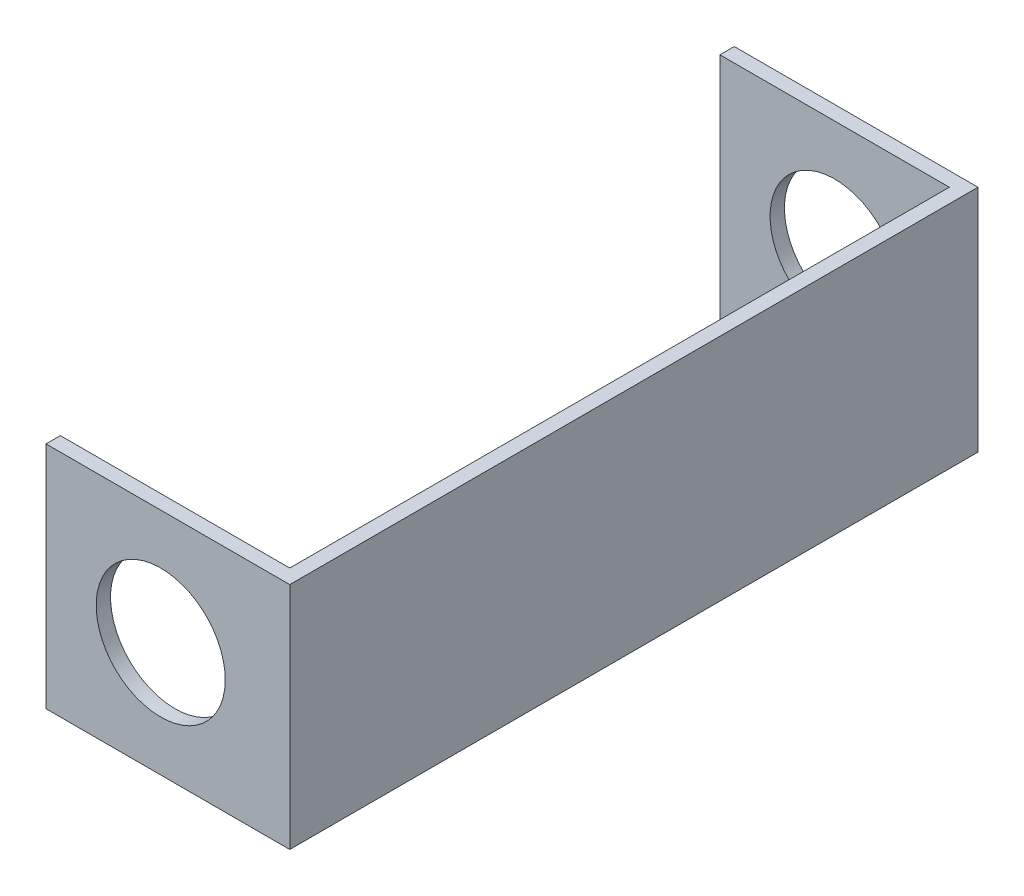
ISO-10303-21;
HEADER;
FILE_DESCRIPTION(('STEP AP214'),'2;1');
FILE_NAME('part.step','',(''),(''),'','','');
FILE_SCHEMA(('AUTOMOTIVE_DESIGN { 1 0 10303 214 1 1 1 1 }'));
ENDSEC;
DATA;
#1=APPLICATION_CONTEXT('core data for automotive mechanical design processes');
#2=APPLICATION_PROTOCOL_DEFINITION('international standard','automotive_design',2000,#1);
#3=PRODUCT_CONTEXT('',#1,'mechanical');
#4=PRODUCT('Part','Part','',(#3));
#5=PRODUCT_RELATED_PRODUCT_CATEGORY('part','',(#4));
#6=PRODUCT_DEFINITION_FORMATION('','',#4);
#7=PRODUCT_DEFINITION_CONTEXT('part definition',#1,'design');
#8=PRODUCT_DEFINITION('design','',#6,#7);
#9=PRODUCT_DEFINITION_SHAPE('','',#8);
#10=(LENGTH_UNIT() NAMED_UNIT(*) SI_UNIT(.MILLI.,.METRE.));
#11=(NAMED_UNIT(*) PLANE_ANGLE_UNIT() SI_UNIT($,.RADIAN.));
#12=(NAMED_UNIT(*) SI_UNIT($,.STERADIAN.) SOLID_ANGLE_UNIT());
#13=UNCERTAINTY_MEASURE_WITH_UNIT(LENGTH_MEASURE(1.E-05),#10,'distance_accuracy_value','');
#14=(GEOMETRIC_REPRESENTATION_CONTEXT(3) GLOBAL_UNCERTAINTY_ASSIGNED_CONTEXT((#13)) GLOBAL_UNIT_ASSIGNED_CONTEXT((#10,
#11,#12)) REPRESENTATION_CONTEXT('',''));
#15=CARTESIAN_POINT('',(0.,0.,0.));
#16=DIRECTION('',(0.,0.,1.));
#17=DIRECTION('',(1.,0.,0.));
#18=AXIS2_PLACEMENT_3D('',#15,#16,#17);
#19=CARTESIAN_POINT('',(0.,0.,3.175));
#20=DIRECTION('',(0.,0.,1.));
#21=DIRECTION('',(1.,0.,0.));
#22=AXIS2_PLACEMENT_3D('',#19,#20,#21);
#23=PLANE('',#22);
#24=DIRECTION('',(0.,-1.,0.));
#25=VECTOR('',#24,1.);
#26=CARTESIAN_POINT('',(50.8,0.,3.175));
#27=LINE('',#26,#25);
#28=CARTESIAN_POINT('',(50.8,0.,3.175));
#29=VERTEX_POINT('',#28);
#30=CARTESIAN_POINT('',(50.8,-50.8,3.175));
#31=VERTEX_POINT('',#30);
#32=EDGE_CURVE('E50',#29,#31,#27,.T.);
#33=ORIENTED_EDGE('',*,*,#32,.F.);
#34=DIRECTION('',(-1.,0.,0.));
#35=VECTOR('',#34,1.);
#36=CARTESIAN_POINT('',(0.,0.,3.175));
#37=LINE('',#36,#35);
#38=CARTESIAN_POINT('',(0.,0.,3.175));
#39=VERTEX_POINT('',#38);
#40=EDGE_CURVE('E55',#29,#39,#37,.T.);
#41=ORIENTED_EDGE('',*,*,#40,.T.);
#42=DIRECTION('',(0.,-1.,0.));
#43=VECTOR('',#42,1.);
#44=CARTESIAN_POINT('',(0.,0.,3.175));
#45=LINE('',#44,#43);
#46=CARTESIAN_POINT('',(0.,-50.8,3.175));
#47=VERTEX_POINT('',#46);
#48=EDGE_CURVE('E86',#39,#47,#45,.T.);
#49=ORIENTED_EDGE('',*,*,#48,.T.);
#50=DIRECTION('',(1.,0.,0.));
#51=VECTOR('',#50,1.);
#52=CARTESIAN_POINT('',(0.,-50.8,3.175));
#53=LINE('',#52,#51);
#54=EDGE_CURVE('E142',#47,#31,#53,.T.);
#55=ORIENTED_EDGE('',*,*,#54,.T.);
#56=EDGE_LOOP('',(#33,#41,#49,#55));
#57=FACE_BOUND('',#56,.T.);
#58=CARTESIAN_POINT('',(25.4,-25.4,3.175));
#59=DIRECTION('',(0.,0.,1.));
#60=DIRECTION('',(1.,0.,0.));
#61=AXIS2_PLACEMENT_3D('',#58,#59,#60);
#62=CIRCLE('',#61,14.2875);
#63=CARTESIAN_POINT('',(39.6875,-25.4,3.175));
#64=VERTEX_POINT('',#63);
#65=EDGE_CURVE('E97',#64,#64,#62,.T.);
#66=ORIENTED_EDGE('',*,*,#65,.F.);
#67=EDGE_LOOP('',(#66));
#68=FACE_BOUND('',#67,.T.);
#69=ADVANCED_FACE('F35',(#57,#68),#23,.T.);
#70=CARTESIAN_POINT('',(0.,0.,0.));
#71=DIRECTION('',(0.,0.,1.));
#72=DIRECTION('',(1.,0.,0.));
#73=AXIS2_PLACEMENT_3D('',#70,#71,#72);
#74=PLANE('',#73);
#75=DIRECTION('',(0.,-1.,0.));
#76=VECTOR('',#75,1.);
#77=CARTESIAN_POINT('',(0.,0.,0.));
#78=LINE('',#77,#76);
#79=CARTESIAN_POINT('',(0.,0.,0.));
#80=VERTEX_POINT('',#79);
#81=CARTESIAN_POINT('',(0.,-50.8,0.));
#82=VERTEX_POINT('',#81);
#83=EDGE_CURVE('E92',#80,#82,#78,.T.);
#84=ORIENTED_EDGE('',*,*,#83,.F.);
#85=DIRECTION('',(-1.,0.,0.));
#86=VECTOR('',#85,1.);
#87=CARTESIAN_POINT('',(0.,0.,0.));
#88=LINE('',#87,#86);
#89=CARTESIAN_POINT('',(53.975,0.,0.));
#90=VERTEX_POINT('',#89);
#91=EDGE_CURVE('E75',#90,#80,#88,.T.);
#92=ORIENTED_EDGE('',*,*,#91,.F.);
#93=DIRECTION('',(0.,1.,0.));
#94=VECTOR('',#93,1.);
#95=CARTESIAN_POINT('',(53.975,0.,0.));
#96=LINE('',#95,#94);
#97=CARTESIAN_POINT('',(53.975,-50.8,0.));
#98=VERTEX_POINT('',#97);
#99=EDGE_CURVE('E87',#98,#90,#96,.T.);
#100=ORIENTED_EDGE('',*,*,#99,.F.);
#101=DIRECTION('',(1.,0.,0.));
#102=VECTOR('',#101,1.);
#103=CARTESIAN_POINT('',(0.,-50.8,0.));
#104=LINE('',#103,#102);
#105=EDGE_CURVE('E96',#82,#98,#104,.T.);
#106=ORIENTED_EDGE('',*,*,#105,.F.);
#107=EDGE_LOOP('',(#84,#92,#100,#106));
#108=FACE_BOUND('',#107,.T.);
#109=CARTESIAN_POINT('',(25.4,-25.4,0.));
#110=DIRECTION('',(0.,0.,1.));
#111=DIRECTION('',(1.,0.,0.));
#112=AXIS2_PLACEMENT_3D('',#109,#110,#111);
#113=CIRCLE('',#112,14.2875);
#114=CARTESIAN_POINT('',(39.6875,-25.4,0.));
#115=VERTEX_POINT('',#114);
#116=EDGE_CURVE('E101',#115,#115,#113,.T.);
#117=ORIENTED_EDGE('',*,*,#116,.T.);
#118=EDGE_LOOP('',(#117));
#119=FACE_BOUND('',#118,.T.);
#120=ADVANCED_FACE('F94',(#108,#119),#74,.F.);
#121=CARTESIAN_POINT('',(0.,0.,3.175));
#122=DIRECTION('',(1.,0.,0.));
#123=DIRECTION('',(0.,0.,-1.));
#124=AXIS2_PLACEMENT_3D('',#121,#122,#123);
#125=PLANE('',#124);
#126=ORIENTED_EDGE('',*,*,#83,.T.);
#127=DIRECTION('',(0.,0.,-1.));
#128=VECTOR('',#127,1.);
#129=CARTESIAN_POINT('',(0.,-50.8,3.175));
#130=LINE('',#129,#128);
#131=EDGE_CURVE('E11',#47,#82,#130,.T.);
#132=ORIENTED_EDGE('',*,*,#131,.F.);
#133=ORIENTED_EDGE('',*,*,#48,.F.);
#134=DIRECTION('',(0.,0.,-1.));
#135=VECTOR('',#134,1.);
#136=CARTESIAN_POINT('',(0.,0.,3.175));
#137=LINE('',#136,#135);
#138=EDGE_CURVE('E78',#39,#80,#137,.T.);
#139=ORIENTED_EDGE('',*,*,#138,.T.);
#140=EDGE_LOOP('',(#126,#132,#133,#139));
#141=FACE_BOUND('',#140,.T.);
#142=ADVANCED_FACE('F37',(#141),#125,.F.);
#143=CARTESIAN_POINT('',(0.,-50.8,3.175));
#144=DIRECTION('',(0.,1.,0.));
#145=DIRECTION('',(0.,0.,1.));
#146=AXIS2_PLACEMENT_3D('',#143,#144,#145);
#147=PLANE('',#146);
#148=ORIENTED_EDGE('',*,*,#105,.T.);
#149=DIRECTION('',(0.,0.,-1.));
#150=VECTOR('',#149,1.);
#151=CARTESIAN_POINT('',(53.975,-50.8,3.175));
#152=LINE('',#151,#150);
#153=CARTESIAN_POINT('',(53.975,-50.8,152.4));
#154=VERTEX_POINT('',#153);
#155=EDGE_CURVE('E43',#154,#98,#152,.T.);
#156=ORIENTED_EDGE('',*,*,#155,.F.);
#157=DIRECTION('',(1.,0.,0.));
#158=VECTOR('',#157,1.);
#159=CARTESIAN_POINT('',(0.,-50.8,152.4));
#160=LINE('',#159,#158);
#161=CARTESIAN_POINT('',(0.,-50.8,152.4));
#162=VERTEX_POINT('',#161);
#163=EDGE_CURVE('E121',#162,#154,#160,.T.);
#164=ORIENTED_EDGE('',*,*,#163,.F.);
#165=DIRECTION('',(0.,0.,-1.));
#166=VECTOR('',#165,1.);
#167=CARTESIAN_POINT('',(0.,-50.8,152.4));
#168=LINE('',#167,#166);
#169=CARTESIAN_POINT('',(0.,-50.8,149.225));
#170=VERTEX_POINT('',#169);
#171=EDGE_CURVE('E298',#162,#170,#168,.T.);
#172=ORIENTED_EDGE('',*,*,#171,.T.);
#173=DIRECTION('',(1.,0.,0.));
#174=VECTOR('',#173,1.);
#175=CARTESIAN_POINT('',(0.,-50.8,149.225));
#176=LINE('',#175,#174);
#177=CARTESIAN_POINT('',(50.8,-50.8,149.225));
#178=VERTEX_POINT('',#177);
#179=EDGE_CURVE('E157',#170,#178,#176,.T.);
#180=ORIENTED_EDGE('',*,*,#179,.T.);
#181=DIRECTION('',(0.,0.,-1.));
#182=VECTOR('',#181,1.);
#183=CARTESIAN_POINT('',(50.8,-50.8,149.225));
#184=LINE('',#183,#182);
#185=EDGE_CURVE('E149',#178,#31,#184,.T.);
#186=ORIENTED_EDGE('',*,*,#185,.T.);
#187=ORIENTED_EDGE('',*,*,#54,.F.);
#188=ORIENTED_EDGE('',*,*,#131,.T.);
#189=EDGE_LOOP('',(#148,#156,#164,#172,#180,#186,#187,#188));
#190=FACE_BOUND('',#189,.T.);
#191=ADVANCED_FACE('F118',(#190),#147,.F.);
#192=CARTESIAN_POINT('',(53.975,0.,3.175));
#193=DIRECTION('',(-1.,0.,0.));
#194=DIRECTION('',(0.,-1.,0.));
#195=AXIS2_PLACEMENT_3D('',#192,#193,#194);
#196=PLANE('',#195);
#197=ORIENTED_EDGE('',*,*,#99,.T.);
#198=DIRECTION('',(0.,0.,-1.));
#199=VECTOR('',#198,1.);
#200=CARTESIAN_POINT('',(53.975,0.,3.175));
#201=LINE('',#200,#199);
#202=CARTESIAN_POINT('',(53.975,0.,152.4));
#203=VERTEX_POINT('',#202);
#204=EDGE_CURVE('E82',#203,#90,#201,.T.);
#205=ORIENTED_EDGE('',*,*,#204,.F.);
#206=DIRECTION('',(0.,1.,0.));
#207=VECTOR('',#206,1.);
#208=CARTESIAN_POINT('',(53.975,0.,152.4));
#209=LINE('',#208,#207);
#210=EDGE_CURVE('E114',#154,#203,#209,.T.);
#211=ORIENTED_EDGE('',*,*,#210,.F.);
#212=ORIENTED_EDGE('',*,*,#155,.T.);
#213=EDGE_LOOP('',(#197,#205,#211,#212));
#214=FACE_BOUND('',#213,.T.);
#215=ADVANCED_FACE('F111',(#214),#196,.F.);
#216=CARTESIAN_POINT('',(0.,0.,3.175));
#217=DIRECTION('',(0.,-1.,0.));
#218=DIRECTION('',(1.,0.,0.));
#219=AXIS2_PLACEMENT_3D('',#216,#217,#218);
#220=PLANE('',#219);
#221=ORIENTED_EDGE('',*,*,#91,.T.);
#222=ORIENTED_EDGE('',*,*,#138,.F.);
#223=ORIENTED_EDGE('',*,*,#40,.F.);
#224=DIRECTION('',(0.,0.,-1.));
#225=VECTOR('',#224,1.);
#226=CARTESIAN_POINT('',(50.8,0.,149.225));
#227=LINE('',#226,#225);
#228=CARTESIAN_POINT('',(50.8,0.,149.225));
#229=VERTEX_POINT('',#228);
#230=EDGE_CURVE('E151',#229,#29,#227,.T.);
#231=ORIENTED_EDGE('',*,*,#230,.F.);
#232=DIRECTION('',(-1.,0.,0.));
#233=VECTOR('',#232,1.);
#234=CARTESIAN_POINT('',(0.,0.,149.225));
#235=LINE('',#234,#233);
#236=CARTESIAN_POINT('',(0.,0.,149.225));
#237=VERTEX_POINT('',#236);
#238=EDGE_CURVE('E307',#229,#237,#235,.T.);
#239=ORIENTED_EDGE('',*,*,#238,.T.);
#240=DIRECTION('',(0.,0.,-1.));
#241=VECTOR('',#240,1.);
#242=CARTESIAN_POINT('',(0.,0.,152.4));
#243=LINE('',#242,#241);
#244=CARTESIAN_POINT('',(0.,0.,152.4));
#245=VERTEX_POINT('',#244);
#246=EDGE_CURVE('E153',#245,#237,#243,.T.);
#247=ORIENTED_EDGE('',*,*,#246,.F.);
#248=DIRECTION('',(-1.,0.,0.));
#249=VECTOR('',#248,1.);
#250=CARTESIAN_POINT('',(0.,0.,152.4));
#251=LINE('',#250,#249);
#252=EDGE_CURVE('E302',#203,#245,#251,.T.);
#253=ORIENTED_EDGE('',*,*,#252,.F.);
#254=ORIENTED_EDGE('',*,*,#204,.T.);
#255=EDGE_LOOP('',(#221,#222,#223,#231,#239,#247,#253,#254));
#256=FACE_BOUND('',#255,.T.);
#257=ADVANCED_FACE('F77',(#256),#220,.F.);
#258=CARTESIAN_POINT('',(25.4,-25.4,3.175));
#259=DIRECTION('',(0.,0.,-1.));
#260=DIRECTION('',(-1.,0.,0.));
#261=AXIS2_PLACEMENT_3D('',#258,#259,#260);
#262=CYLINDRICAL_SURFACE('',#261,14.2875);
#263=ORIENTED_EDGE('',*,*,#65,.T.);
#264=EDGE_LOOP('',(#263));
#265=FACE_BOUND('',#264,.T.);
#266=ORIENTED_EDGE('',*,*,#116,.F.);
#267=EDGE_LOOP('',(#266));
#268=FACE_BOUND('',#267,.T.);
#269=ADVANCED_FACE('F166',(#265,#268),#262,.F.);
#270=CARTESIAN_POINT('',(50.8,0.,149.225));
#271=DIRECTION('',(1.,0.,0.));
#272=DIRECTION('',(0.,1.,0.));
#273=AXIS2_PLACEMENT_3D('',#270,#271,#272);
#274=PLANE('',#273);
#275=ORIENTED_EDGE('',*,*,#32,.T.);
#276=ORIENTED_EDGE('',*,*,#185,.F.);
#277=DIRECTION('',(0.,-1.,0.));
#278=VECTOR('',#277,1.);
#279=CARTESIAN_POINT('',(50.8,0.,149.225));
#280=LINE('',#279,#278);
#281=EDGE_CURVE('E152',#229,#178,#280,.T.);
#282=ORIENTED_EDGE('',*,*,#281,.F.);
#283=ORIENTED_EDGE('',*,*,#230,.T.);
#284=EDGE_LOOP('',(#275,#276,#282,#283));
#285=FACE_BOUND('',#284,.T.);
#286=ADVANCED_FACE('F147',(#285),#274,.F.);
#287=CARTESIAN_POINT('',(0.,0.,149.225));
#288=DIRECTION('',(0.,0.,1.));
#289=DIRECTION('',(1.,0.,0.));
#290=AXIS2_PLACEMENT_3D('',#287,#288,#289);
#291=PLANE('',#290);
#292=CARTESIAN_POINT('',(25.4,-25.4,149.225));
#293=DIRECTION('',(0.,0.,1.));
#294=DIRECTION('',(1.,0.,0.));
#295=AXIS2_PLACEMENT_3D('',#292,#293,#294);
#296=CIRCLE('',#295,14.2875);
#297=CARTESIAN_POINT('',(39.6875,-25.4,149.225));
#298=VERTEX_POINT('',#297);
#299=EDGE_CURVE('E311',#298,#298,#296,.T.);
#300=ORIENTED_EDGE('',*,*,#299,.T.);
#301=EDGE_LOOP('',(#300));
#302=FACE_BOUND('',#301,.T.);
#303=ORIENTED_EDGE('',*,*,#238,.F.);
#304=ORIENTED_EDGE('',*,*,#281,.T.);
#305=ORIENTED_EDGE('',*,*,#179,.F.);
#306=DIRECTION('',(0.,-1.,0.));
#307=VECTOR('',#306,1.);
#308=CARTESIAN_POINT('',(0.,0.,149.225));
#309=LINE('',#308,#307);
#310=EDGE_CURVE('E309',#237,#170,#309,.T.);
#311=ORIENTED_EDGE('',*,*,#310,.F.);
#312=EDGE_LOOP('',(#303,#304,#305,#311));
#313=FACE_BOUND('',#312,.T.);
#314=ADVANCED_FACE('F174',(#302,#313),#291,.F.);
#315=CARTESIAN_POINT('',(0.,0.,152.4));
#316=DIRECTION('',(1.,0.,0.));
#317=DIRECTION('',(0.,0.,-1.));
#318=AXIS2_PLACEMENT_3D('',#315,#316,#317);
#319=PLANE('',#318);
#320=ORIENTED_EDGE('',*,*,#310,.T.);
#321=ORIENTED_EDGE('',*,*,#171,.F.);
#322=DIRECTION('',(0.,-1.,0.));
#323=VECTOR('',#322,1.);
#324=CARTESIAN_POINT('',(0.,0.,152.4));
#325=LINE('',#324,#323);
#326=EDGE_CURVE('E299',#245,#162,#325,.T.);
#327=ORIENTED_EDGE('',*,*,#326,.F.);
#328=ORIENTED_EDGE('',*,*,#246,.T.);
#329=EDGE_LOOP('',(#320,#321,#327,#328));
#330=FACE_BOUND('',#329,.T.);
#331=ADVANCED_FACE('F257',(#330),#319,.F.);
#332=CARTESIAN_POINT('',(25.4,-25.4,152.4));
#333=DIRECTION('',(0.,0.,-1.));
#334=DIRECTION('',(-1.,0.,0.));
#335=AXIS2_PLACEMENT_3D('',#332,#333,#334);
#336=CYLINDRICAL_SURFACE('',#335,14.2875);
#337=CARTESIAN_POINT('',(25.4,-25.4,152.4));
#338=DIRECTION('',(0.,0.,1.));
#339=DIRECTION('',(1.,0.,0.));
#340=AXIS2_PLACEMENT_3D('',#337,#338,#339);
#341=CIRCLE('',#340,14.2875);
#342=CARTESIAN_POINT('',(39.6875,-25.4,152.4));
#343=VERTEX_POINT('',#342);
#344=EDGE_CURVE('E297',#343,#343,#341,.T.);
#345=ORIENTED_EDGE('',*,*,#344,.T.);
#346=EDGE_LOOP('',(#345));
#347=FACE_BOUND('',#346,.T.);
#348=ORIENTED_EDGE('',*,*,#299,.F.);
#349=EDGE_LOOP('',(#348));
#350=FACE_BOUND('',#349,.T.);
#351=ADVANCED_FACE('F267',(#347,#350),#336,.F.);
#352=CARTESIAN_POINT('',(0.,0.,152.4));
#353=DIRECTION('',(0.,0.,1.));
#354=DIRECTION('',(1.,0.,0.));
#355=AXIS2_PLACEMENT_3D('',#352,#353,#354);
#356=PLANE('',#355);
#357=ORIENTED_EDGE('',*,*,#163,.T.);
#358=ORIENTED_EDGE('',*,*,#210,.T.);
#359=ORIENTED_EDGE('',*,*,#252,.T.);
#360=ORIENTED_EDGE('',*,*,#326,.T.);
#361=EDGE_LOOP('',(#357,#358,#359,#360));
#362=FACE_BOUND('',#361,.T.);
#363=ORIENTED_EDGE('',*,*,#344,.F.);
#364=EDGE_LOOP('',(#363));
#365=FACE_BOUND('',#364,.T.);
#366=ADVANCED_FACE('F277',(#362,#365),#356,.T.);
#367=CLOSED_SHELL('',(#69,#120,#142,#191,#215,#257,#269,#286,#314,#331,#351,#366));
#368=MANIFOLD_SOLID_BREP('B2',#367);
#369=ADVANCED_BREP_SHAPE_REPRESENTATION('',(#18,#368),#14);
#370=SHAPE_DEFINITION_REPRESENTATION(#9,#369);
ENDSEC;
END-ISO-10303-21;
